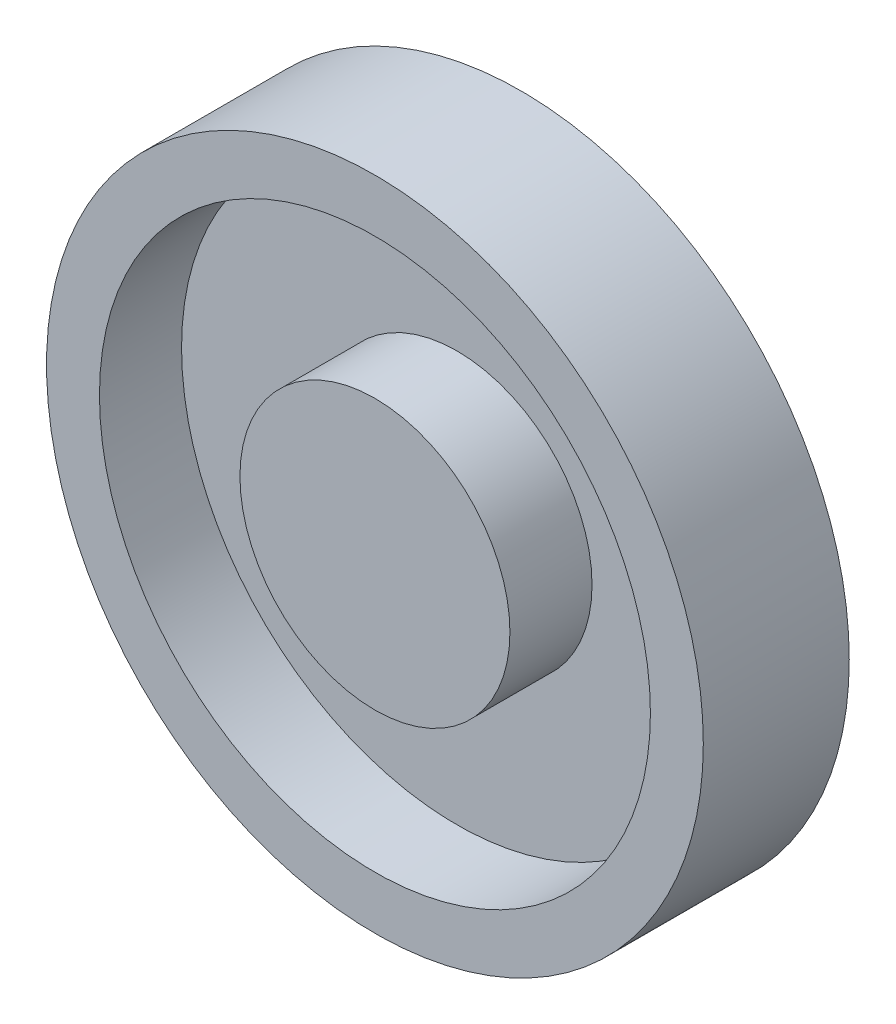
ISO-10303-21;
HEADER;
FILE_DESCRIPTION(('STEP AP214'),'2;1');
FILE_NAME('part.step','',(''),(''),'','','');
FILE_SCHEMA(('AUTOMOTIVE_DESIGN { 1 0 10303 214 1 1 1 1 }'));
ENDSEC;
DATA;
#1=APPLICATION_CONTEXT('core data for automotive mechanical design processes');
#2=APPLICATION_PROTOCOL_DEFINITION('international standard','automotive_design',2000,#1);
#3=PRODUCT_CONTEXT('',#1,'mechanical');
#4=PRODUCT('Part','Part','',(#3));
#5=PRODUCT_RELATED_PRODUCT_CATEGORY('part','',(#4));
#6=PRODUCT_DEFINITION_FORMATION('','',#4);
#7=PRODUCT_DEFINITION_CONTEXT('part definition',#1,'design');
#8=PRODUCT_DEFINITION('design','',#6,#7);
#9=PRODUCT_DEFINITION_SHAPE('','',#8);
#10=(LENGTH_UNIT() NAMED_UNIT(*) SI_UNIT(.MILLI.,.METRE.));
#11=(NAMED_UNIT(*) PLANE_ANGLE_UNIT() SI_UNIT($,.RADIAN.));
#12=(NAMED_UNIT(*) SI_UNIT($,.STERADIAN.) SOLID_ANGLE_UNIT());
#13=UNCERTAINTY_MEASURE_WITH_UNIT(LENGTH_MEASURE(1.E-05),#10,'distance_accuracy_value','');
#14=(GEOMETRIC_REPRESENTATION_CONTEXT(3) GLOBAL_UNCERTAINTY_ASSIGNED_CONTEXT((#13)) GLOBAL_UNIT_ASSIGNED_CONTEXT((#10,
#11,#12)) REPRESENTATION_CONTEXT('',''));
#15=CARTESIAN_POINT('',(0.,0.,0.));
#16=DIRECTION('',(0.,0.,1.));
#17=DIRECTION('',(1.,0.,0.));
#18=AXIS2_PLACEMENT_3D('',#15,#16,#17);
#19=CARTESIAN_POINT('',(0.,0.,8.));
#20=DIRECTION('',(0.,0.,-1.));
#21=DIRECTION('',(-1.,0.,0.));
#22=AXIS2_PLACEMENT_3D('',#19,#20,#21);
#23=CYLINDRICAL_SURFACE('',#22,18.);
#24=CARTESIAN_POINT('',(0.,0.,8.));
#25=DIRECTION('',(0.,0.,1.));
#26=DIRECTION('',(1.,0.,0.));
#27=AXIS2_PLACEMENT_3D('',#24,#25,#26);
#28=CIRCLE('',#27,18.);
#29=CARTESIAN_POINT('',(18.,0.,8.));
#30=VERTEX_POINT('',#29);
#31=EDGE_CURVE('E10',#30,#30,#28,.T.);
#32=ORIENTED_EDGE('',*,*,#31,.F.);
#33=EDGE_LOOP('',(#32));
#34=FACE_BOUND('',#33,.T.);
#35=CARTESIAN_POINT('',(0.,0.,0.));
#36=DIRECTION('',(0.,0.,1.));
#37=DIRECTION('',(1.,0.,0.));
#38=AXIS2_PLACEMENT_3D('',#35,#36,#37);
#39=CIRCLE('',#38,18.);
#40=CARTESIAN_POINT('',(18.,0.,0.));
#41=VERTEX_POINT('',#40);
#42=EDGE_CURVE('E34',#41,#41,#39,.T.);
#43=ORIENTED_EDGE('',*,*,#42,.T.);
#44=EDGE_LOOP('',(#43));
#45=FACE_BOUND('',#44,.T.);
#46=ADVANCED_FACE('F31',(#34,#45),#23,.T.);
#47=CARTESIAN_POINT('',(0.,0.,8.));
#48=DIRECTION('',(0.,0.,1.));
#49=DIRECTION('',(1.,0.,0.));
#50=AXIS2_PLACEMENT_3D('',#47,#48,#49);
#51=PLANE('',#50);
#52=CARTESIAN_POINT('',(0.,0.,8.));
#53=DIRECTION('',(0.,0.,1.));
#54=DIRECTION('',(1.,0.,0.));
#55=AXIS2_PLACEMENT_3D('',#52,#53,#54);
#56=CIRCLE('',#55,15.1);
#57=CARTESIAN_POINT('',(15.1,0.,8.));
#58=VERTEX_POINT('',#57);
#59=EDGE_CURVE('E43',#58,#58,#56,.T.);
#60=ORIENTED_EDGE('',*,*,#59,.F.);
#61=EDGE_LOOP('',(#60));
#62=FACE_BOUND('',#61,.T.);
#63=ORIENTED_EDGE('',*,*,#31,.T.);
#64=EDGE_LOOP('',(#63));
#65=FACE_BOUND('',#64,.T.);
#66=ADVANCED_FACE('F71',(#62,#65),#51,.T.);
#67=CARTESIAN_POINT('',(0.,0.,0.));
#68=DIRECTION('',(0.,0.,1.));
#69=DIRECTION('',(1.,0.,0.));
#70=AXIS2_PLACEMENT_3D('',#67,#68,#69);
#71=PLANE('',#70);
#72=ORIENTED_EDGE('',*,*,#42,.F.);
#73=EDGE_LOOP('',(#72));
#74=FACE_BOUND('',#73,.T.);
#75=ADVANCED_FACE('F67',(#74),#71,.F.);
#76=CARTESIAN_POINT('',(0.,0.,3.5));
#77=DIRECTION('',(0.,0.,1.));
#78=DIRECTION('',(1.,0.,0.));
#79=AXIS2_PLACEMENT_3D('',#76,#77,#78);
#80=CYLINDRICAL_SURFACE('',#79,15.1);
#81=CARTESIAN_POINT('',(0.,0.,3.5));
#82=DIRECTION('',(0.,0.,1.));
#83=DIRECTION('',(1.,0.,0.));
#84=AXIS2_PLACEMENT_3D('',#81,#82,#83);
#85=CIRCLE('',#84,15.1);
#86=CARTESIAN_POINT('',(15.1,0.,3.5));
#87=VERTEX_POINT('',#86);
#88=EDGE_CURVE('E41',#87,#87,#85,.T.);
#89=ORIENTED_EDGE('',*,*,#88,.F.);
#90=EDGE_LOOP('',(#89));
#91=FACE_BOUND('',#90,.T.);
#92=ORIENTED_EDGE('',*,*,#59,.T.);
#93=EDGE_LOOP('',(#92));
#94=FACE_BOUND('',#93,.T.);
#95=ADVANCED_FACE('F61',(#91,#94),#80,.F.);
#96=CARTESIAN_POINT('',(0.,0.,3.5));
#97=DIRECTION('',(0.,0.,1.));
#98=DIRECTION('',(1.,0.,0.));
#99=AXIS2_PLACEMENT_3D('',#96,#97,#98);
#100=PLANE('',#99);
#101=CARTESIAN_POINT('',(0.,0.,3.5));
#102=DIRECTION('',(0.,0.,1.));
#103=DIRECTION('',(1.,0.,0.));
#104=AXIS2_PLACEMENT_3D('',#101,#102,#103);
#105=CIRCLE('',#104,7.4);
#106=CARTESIAN_POINT('',(7.4,0.,3.5));
#107=VERTEX_POINT('',#106);
#108=EDGE_CURVE('E46',#107,#107,#105,.T.);
#109=ORIENTED_EDGE('',*,*,#108,.F.);
#110=EDGE_LOOP('',(#109));
#111=FACE_BOUND('',#110,.T.);
#112=ORIENTED_EDGE('',*,*,#88,.T.);
#113=EDGE_LOOP('',(#112));
#114=FACE_BOUND('',#113,.T.);
#115=ADVANCED_FACE('F58',(#111,#114),#100,.T.);
#116=CARTESIAN_POINT('',(0.,0.,3.5));
#117=DIRECTION('',(0.,0.,1.));
#118=DIRECTION('',(1.,0.,0.));
#119=AXIS2_PLACEMENT_3D('',#116,#117,#118);
#120=CYLINDRICAL_SURFACE('',#119,7.4);
#121=ORIENTED_EDGE('',*,*,#108,.T.);
#122=EDGE_LOOP('',(#121));
#123=FACE_BOUND('',#122,.T.);
#124=CARTESIAN_POINT('',(0.,0.,8.));
#125=DIRECTION('',(0.,0.,1.));
#126=DIRECTION('',(1.,0.,0.));
#127=AXIS2_PLACEMENT_3D('',#124,#125,#126);
#128=CIRCLE('',#127,7.4);
#129=CARTESIAN_POINT('',(7.4,0.,8.));
#130=VERTEX_POINT('',#129);
#131=EDGE_CURVE('E49',#130,#130,#128,.T.);
#132=ORIENTED_EDGE('',*,*,#131,.F.);
#133=EDGE_LOOP('',(#132));
#134=FACE_BOUND('',#133,.T.);
#135=ADVANCED_FACE('F55',(#123,#134),#120,.T.);
#136=ORIENTED_EDGE('',*,*,#131,.T.);
#137=EDGE_LOOP('',(#136));
#138=FACE_BOUND('',#137,.T.);
#139=ADVANCED_FACE('F74',(#138),#51,.T.);
#140=CLOSED_SHELL('',(#46,#66,#75,#95,#115,#135,#139));
#141=MANIFOLD_SOLID_BREP('B2',#140);
#142=ADVANCED_BREP_SHAPE_REPRESENTATION('',(#18,#141),#14);
#143=SHAPE_DEFINITION_REPRESENTATION(#9,#142);
ENDSEC;
END-ISO-10303-21;
